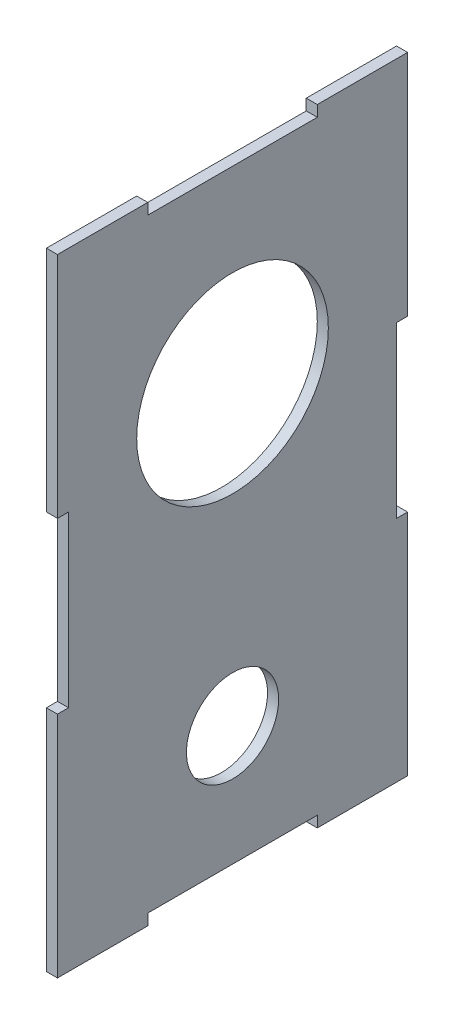
ISO-10303-21;
HEADER;
FILE_DESCRIPTION(('STEP AP214'),'2;1');
FILE_NAME('part.step','',(''),(''),'','','');
FILE_SCHEMA(('AUTOMOTIVE_DESIGN { 1 0 10303 214 1 1 1 1 }'));
ENDSEC;
DATA;
#1=APPLICATION_CONTEXT('core data for automotive mechanical design processes');
#2=APPLICATION_PROTOCOL_DEFINITION('international standard','automotive_design',2000,#1);
#3=PRODUCT_CONTEXT('',#1,'mechanical');
#4=PRODUCT('Part','Part','',(#3));
#5=PRODUCT_RELATED_PRODUCT_CATEGORY('part','',(#4));
#6=PRODUCT_DEFINITION_FORMATION('','',#4);
#7=PRODUCT_DEFINITION_CONTEXT('part definition',#1,'design');
#8=PRODUCT_DEFINITION('design','',#6,#7);
#9=PRODUCT_DEFINITION_SHAPE('','',#8);
#10=(LENGTH_UNIT() NAMED_UNIT(*) SI_UNIT(.MILLI.,.METRE.));
#11=(NAMED_UNIT(*) PLANE_ANGLE_UNIT() SI_UNIT($,.RADIAN.));
#12=(NAMED_UNIT(*) SI_UNIT($,.STERADIAN.) SOLID_ANGLE_UNIT());
#13=UNCERTAINTY_MEASURE_WITH_UNIT(LENGTH_MEASURE(1.E-05),#10,'distance_accuracy_value','');
#14=(GEOMETRIC_REPRESENTATION_CONTEXT(3) GLOBAL_UNCERTAINTY_ASSIGNED_CONTEXT((#13)) GLOBAL_UNIT_ASSIGNED_CONTEXT((#10,
#11,#12)) REPRESENTATION_CONTEXT('',''));
#15=CARTESIAN_POINT('',(0.,0.,0.));
#16=DIRECTION('',(0.,0.,1.));
#17=DIRECTION('',(1.,0.,0.));
#18=AXIS2_PLACEMENT_3D('',#15,#16,#17);
#19=CARTESIAN_POINT('',(3.,0.,0.));
#20=DIRECTION('',(-1.,0.,0.));
#21=DIRECTION('',(0.,0.,1.));
#22=AXIS2_PLACEMENT_3D('',#19,#20,#21);
#23=PLANE('',#22);
#24=DIRECTION('',(0.,-1.,0.));
#25=VECTOR('',#24,1.);
#26=CARTESIAN_POINT('',(3.,85.,47.5));
#27=LINE('',#26,#25);
#28=CARTESIAN_POINT('',(3.,85.,47.5));
#29=VERTEX_POINT('',#28);
#30=CARTESIAN_POINT('',(3.,23.,47.5));
#31=VERTEX_POINT('',#30);
#32=EDGE_CURVE('E241',#29,#31,#27,.T.);
#33=ORIENTED_EDGE('',*,*,#32,.T.);
#34=DIRECTION('',(0.,0.,-1.));
#35=VECTOR('',#34,1.);
#36=CARTESIAN_POINT('',(3.,23.,44.5));
#37=LINE('',#36,#35);
#38=CARTESIAN_POINT('',(3.,23.,44.5));
#39=VERTEX_POINT('',#38);
#40=EDGE_CURVE('E129',#31,#39,#37,.T.);
#41=ORIENTED_EDGE('',*,*,#40,.T.);
#42=DIRECTION('',(0.,-1.,0.));
#43=VECTOR('',#42,1.);
#44=CARTESIAN_POINT('',(3.,-23.,44.5));
#45=LINE('',#44,#43);
#46=CARTESIAN_POINT('',(3.,-23.,44.5));
#47=VERTEX_POINT('',#46);
#48=EDGE_CURVE('E292',#39,#47,#45,.T.);
#49=ORIENTED_EDGE('',*,*,#48,.T.);
#50=DIRECTION('',(0.,0.,1.));
#51=VECTOR('',#50,1.);
#52=CARTESIAN_POINT('',(3.,-23.,44.5));
#53=LINE('',#52,#51);
#54=CARTESIAN_POINT('',(3.,-23.,47.5));
#55=VERTEX_POINT('',#54);
#56=EDGE_CURVE('E311',#47,#55,#53,.T.);
#57=ORIENTED_EDGE('',*,*,#56,.T.);
#58=DIRECTION('',(0.,-1.,0.));
#59=VECTOR('',#58,1.);
#60=CARTESIAN_POINT('',(3.,-23.,47.5));
#61=LINE('',#60,#59);
#62=CARTESIAN_POINT('',(3.,-85.,47.5));
#63=VERTEX_POINT('',#62);
#64=EDGE_CURVE('E308',#55,#63,#61,.T.);
#65=ORIENTED_EDGE('',*,*,#64,.T.);
#66=DIRECTION('',(0.,0.,-1.));
#67=VECTOR('',#66,1.);
#68=CARTESIAN_POINT('',(3.,-85.,47.5));
#69=LINE('',#68,#67);
#70=CARTESIAN_POINT('',(3.,-85.,23.));
#71=VERTEX_POINT('',#70);
#72=EDGE_CURVE('E310',#63,#71,#69,.T.);
#73=ORIENTED_EDGE('',*,*,#72,.T.);
#74=DIRECTION('',(0.,1.,0.));
#75=VECTOR('',#74,1.);
#76=CARTESIAN_POINT('',(3.,-82.,23.));
#77=LINE('',#76,#75);
#78=CARTESIAN_POINT('',(3.,-82.,23.));
#79=VERTEX_POINT('',#78);
#80=EDGE_CURVE('E313',#71,#79,#77,.T.);
#81=ORIENTED_EDGE('',*,*,#80,.T.);
#82=DIRECTION('',(0.,0.,-1.));
#83=VECTOR('',#82,1.);
#84=CARTESIAN_POINT('',(3.,-82.,23.));
#85=LINE('',#84,#83);
#86=CARTESIAN_POINT('',(3.,-82.,-23.));
#87=VERTEX_POINT('',#86);
#88=EDGE_CURVE('E319',#79,#87,#85,.T.);
#89=ORIENTED_EDGE('',*,*,#88,.T.);
#90=DIRECTION('',(0.,-1.,0.));
#91=VECTOR('',#90,1.);
#92=CARTESIAN_POINT('',(3.,-82.,-23.));
#93=LINE('',#92,#91);
#94=CARTESIAN_POINT('',(3.,-85.,-23.));
#95=VERTEX_POINT('',#94);
#96=EDGE_CURVE('E321',#87,#95,#93,.T.);
#97=ORIENTED_EDGE('',*,*,#96,.T.);
#98=DIRECTION('',(0.,0.,-1.));
#99=VECTOR('',#98,1.);
#100=CARTESIAN_POINT('',(3.,-85.,-23.));
#101=LINE('',#100,#99);
#102=CARTESIAN_POINT('',(3.,-85.,-47.5));
#103=VERTEX_POINT('',#102);
#104=EDGE_CURVE('E323',#95,#103,#101,.T.);
#105=ORIENTED_EDGE('',*,*,#104,.T.);
#106=DIRECTION('',(0.,1.,0.));
#107=VECTOR('',#106,1.);
#108=CARTESIAN_POINT('',(3.,-23.,-47.5));
#109=LINE('',#108,#107);
#110=CARTESIAN_POINT('',(3.,-23.,-47.5));
#111=VERTEX_POINT('',#110);
#112=EDGE_CURVE('E325',#103,#111,#109,.T.);
#113=ORIENTED_EDGE('',*,*,#112,.T.);
#114=DIRECTION('',(0.,0.,1.));
#115=VECTOR('',#114,1.);
#116=CARTESIAN_POINT('',(3.,-23.,-44.5));
#117=LINE('',#116,#115);
#118=CARTESIAN_POINT('',(3.,-23.,-44.5));
#119=VERTEX_POINT('',#118);
#120=EDGE_CURVE('E327',#111,#119,#117,.T.);
#121=ORIENTED_EDGE('',*,*,#120,.T.);
#122=DIRECTION('',(0.,1.,0.));
#123=VECTOR('',#122,1.);
#124=CARTESIAN_POINT('',(3.,-23.,-44.5));
#125=LINE('',#124,#123);
#126=CARTESIAN_POINT('',(3.,23.,-44.5));
#127=VERTEX_POINT('',#126);
#128=EDGE_CURVE('E329',#119,#127,#125,.T.);
#129=ORIENTED_EDGE('',*,*,#128,.T.);
#130=DIRECTION('',(0.,0.,-1.));
#131=VECTOR('',#130,1.);
#132=CARTESIAN_POINT('',(3.,23.,-44.5));
#133=LINE('',#132,#131);
#134=CARTESIAN_POINT('',(3.,23.,-47.5));
#135=VERTEX_POINT('',#134);
#136=EDGE_CURVE('E331',#127,#135,#133,.T.);
#137=ORIENTED_EDGE('',*,*,#136,.T.);
#138=DIRECTION('',(0.,1.,0.));
#139=VECTOR('',#138,1.);
#140=CARTESIAN_POINT('',(3.,85.,-47.5));
#141=LINE('',#140,#139);
#142=CARTESIAN_POINT('',(3.,85.,-47.5));
#143=VERTEX_POINT('',#142);
#144=EDGE_CURVE('E333',#135,#143,#141,.T.);
#145=ORIENTED_EDGE('',*,*,#144,.T.);
#146=DIRECTION('',(0.,0.,1.));
#147=VECTOR('',#146,1.);
#148=CARTESIAN_POINT('',(3.,85.,-23.));
#149=LINE('',#148,#147);
#150=CARTESIAN_POINT('',(3.,85.,-23.));
#151=VERTEX_POINT('',#150);
#152=EDGE_CURVE('E335',#143,#151,#149,.T.);
#153=ORIENTED_EDGE('',*,*,#152,.T.);
#154=DIRECTION('',(0.,-1.,0.));
#155=VECTOR('',#154,1.);
#156=CARTESIAN_POINT('',(3.,82.,-23.));
#157=LINE('',#156,#155);
#158=CARTESIAN_POINT('',(3.,82.,-23.));
#159=VERTEX_POINT('',#158);
#160=EDGE_CURVE('E184',#151,#159,#157,.T.);
#161=ORIENTED_EDGE('',*,*,#160,.T.);
#162=DIRECTION('',(0.,0.,1.));
#163=VECTOR('',#162,1.);
#164=CARTESIAN_POINT('',(3.,82.,23.));
#165=LINE('',#164,#163);
#166=CARTESIAN_POINT('',(3.,82.,23.));
#167=VERTEX_POINT('',#166);
#168=EDGE_CURVE('E178',#159,#167,#165,.T.);
#169=ORIENTED_EDGE('',*,*,#168,.T.);
#170=DIRECTION('',(0.,1.,0.));
#171=VECTOR('',#170,1.);
#172=CARTESIAN_POINT('',(3.,82.,23.));
#173=LINE('',#172,#171);
#174=CARTESIAN_POINT('',(3.,85.,23.));
#175=VERTEX_POINT('',#174);
#176=EDGE_CURVE('E182',#167,#175,#173,.T.);
#177=ORIENTED_EDGE('',*,*,#176,.T.);
#178=DIRECTION('',(0.,0.,1.));
#179=VECTOR('',#178,1.);
#180=CARTESIAN_POINT('',(3.,85.,47.5));
#181=LINE('',#180,#179);
#182=EDGE_CURVE('E50',#175,#29,#181,.T.);
#183=ORIENTED_EDGE('',*,*,#182,.T.);
#184=EDGE_LOOP('',(#33,#41,#49,#57,#65,#73,#81,#89,#97,#105,#113,#121,#129,#137,#145,#153,#161,
#169,#177,#183));
#185=FACE_BOUND('',#184,.T.);
#186=CARTESIAN_POINT('',(3.,31.,0.));
#187=DIRECTION('',(1.,0.,0.));
#188=DIRECTION('',(0.,0.,-1.));
#189=AXIS2_PLACEMENT_3D('',#186,#187,#188);
#190=CIRCLE('',#189,26.);
#191=CARTESIAN_POINT('',(3.,31.,-26.));
#192=VERTEX_POINT('',#191);
#193=EDGE_CURVE('E206',#192,#192,#190,.T.);
#194=ORIENTED_EDGE('',*,*,#193,.F.);
#195=EDGE_LOOP('',(#194));
#196=FACE_BOUND('',#195,.T.);
#197=CARTESIAN_POINT('',(3.,-49.5,0.));
#198=DIRECTION('',(1.,0.,0.));
#199=DIRECTION('',(0.,0.,-1.));
#200=AXIS2_PLACEMENT_3D('',#197,#198,#199);
#201=CIRCLE('',#200,12.5);
#202=CARTESIAN_POINT('',(3.,-49.5,-12.5));
#203=VERTEX_POINT('',#202);
#204=EDGE_CURVE('E376',#203,#203,#201,.T.);
#205=ORIENTED_EDGE('',*,*,#204,.F.);
#206=EDGE_LOOP('',(#205));
#207=FACE_BOUND('',#206,.T.);
#208=ADVANCED_FACE('F33',(#185,#196,#207),#23,.F.);
#209=CARTESIAN_POINT('',(0.,0.,0.));
#210=DIRECTION('',(-1.,0.,0.));
#211=DIRECTION('',(0.,0.,1.));
#212=AXIS2_PLACEMENT_3D('',#209,#210,#211);
#213=PLANE('',#212);
#214=CARTESIAN_POINT('',(0.,31.,0.));
#215=DIRECTION('',(1.,0.,0.));
#216=DIRECTION('',(0.,0.,-1.));
#217=AXIS2_PLACEMENT_3D('',#214,#215,#216);
#218=CIRCLE('',#217,26.);
#219=CARTESIAN_POINT('',(0.,31.,-26.));
#220=VERTEX_POINT('',#219);
#221=EDGE_CURVE('E381',#220,#220,#218,.T.);
#222=ORIENTED_EDGE('',*,*,#221,.T.);
#223=EDGE_LOOP('',(#222));
#224=FACE_BOUND('',#223,.T.);
#225=DIRECTION('',(0.,-1.,0.));
#226=VECTOR('',#225,1.);
#227=CARTESIAN_POINT('',(0.,85.,47.5));
#228=LINE('',#227,#226);
#229=CARTESIAN_POINT('',(0.,85.,47.5));
#230=VERTEX_POINT('',#229);
#231=CARTESIAN_POINT('',(0.,23.,47.5));
#232=VERTEX_POINT('',#231);
#233=EDGE_CURVE('E202',#230,#232,#228,.T.);
#234=ORIENTED_EDGE('',*,*,#233,.F.);
#235=DIRECTION('',(0.,0.,1.));
#236=VECTOR('',#235,1.);
#237=CARTESIAN_POINT('',(0.,85.,47.5));
#238=LINE('',#237,#236);
#239=CARTESIAN_POINT('',(0.,85.,23.));
#240=VERTEX_POINT('',#239);
#241=EDGE_CURVE('E121',#240,#230,#238,.T.);
#242=ORIENTED_EDGE('',*,*,#241,.F.);
#243=DIRECTION('',(0.,1.,0.));
#244=VECTOR('',#243,1.);
#245=CARTESIAN_POINT('',(0.,82.,23.));
#246=LINE('',#245,#244);
#247=CARTESIAN_POINT('',(0.,82.,23.));
#248=VERTEX_POINT('',#247);
#249=EDGE_CURVE('E115',#248,#240,#246,.T.);
#250=ORIENTED_EDGE('',*,*,#249,.F.);
#251=DIRECTION('',(0.,0.,1.));
#252=VECTOR('',#251,1.);
#253=CARTESIAN_POINT('',(0.,82.,23.));
#254=LINE('',#253,#252);
#255=CARTESIAN_POINT('',(0.,82.,-23.));
#256=VERTEX_POINT('',#255);
#257=EDGE_CURVE('E192',#256,#248,#254,.T.);
#258=ORIENTED_EDGE('',*,*,#257,.F.);
#259=DIRECTION('',(0.,-1.,0.));
#260=VECTOR('',#259,1.);
#261=CARTESIAN_POINT('',(0.,82.,-23.));
#262=LINE('',#261,#260);
#263=CARTESIAN_POINT('',(0.,85.,-23.));
#264=VERTEX_POINT('',#263);
#265=EDGE_CURVE('E236',#264,#256,#262,.T.);
#266=ORIENTED_EDGE('',*,*,#265,.F.);
#267=DIRECTION('',(0.,0.,1.));
#268=VECTOR('',#267,1.);
#269=CARTESIAN_POINT('',(0.,85.,-23.));
#270=LINE('',#269,#268);
#271=CARTESIAN_POINT('',(0.,85.,-47.5));
#272=VERTEX_POINT('',#271);
#273=EDGE_CURVE('E234',#272,#264,#270,.T.);
#274=ORIENTED_EDGE('',*,*,#273,.F.);
#275=DIRECTION('',(0.,1.,0.));
#276=VECTOR('',#275,1.);
#277=CARTESIAN_POINT('',(0.,85.,-47.5));
#278=LINE('',#277,#276);
#279=CARTESIAN_POINT('',(0.,23.,-47.5));
#280=VERTEX_POINT('',#279);
#281=EDGE_CURVE('E232',#280,#272,#278,.T.);
#282=ORIENTED_EDGE('',*,*,#281,.F.);
#283=DIRECTION('',(0.,0.,-1.));
#284=VECTOR('',#283,1.);
#285=CARTESIAN_POINT('',(0.,23.,-44.5));
#286=LINE('',#285,#284);
#287=CARTESIAN_POINT('',(0.,23.,-44.5));
#288=VERTEX_POINT('',#287);
#289=EDGE_CURVE('E230',#288,#280,#286,.T.);
#290=ORIENTED_EDGE('',*,*,#289,.F.);
#291=DIRECTION('',(0.,1.,0.));
#292=VECTOR('',#291,1.);
#293=CARTESIAN_POINT('',(0.,-23.,-44.5));
#294=LINE('',#293,#292);
#295=CARTESIAN_POINT('',(0.,-23.,-44.5));
#296=VERTEX_POINT('',#295);
#297=EDGE_CURVE('E228',#296,#288,#294,.T.);
#298=ORIENTED_EDGE('',*,*,#297,.F.);
#299=DIRECTION('',(0.,0.,1.));
#300=VECTOR('',#299,1.);
#301=CARTESIAN_POINT('',(0.,-23.,-44.5));
#302=LINE('',#301,#300);
#303=CARTESIAN_POINT('',(0.,-23.,-47.5));
#304=VERTEX_POINT('',#303);
#305=EDGE_CURVE('E226',#304,#296,#302,.T.);
#306=ORIENTED_EDGE('',*,*,#305,.F.);
#307=DIRECTION('',(0.,1.,0.));
#308=VECTOR('',#307,1.);
#309=CARTESIAN_POINT('',(0.,-23.,-47.5));
#310=LINE('',#309,#308);
#311=CARTESIAN_POINT('',(0.,-85.,-47.5));
#312=VERTEX_POINT('',#311);
#313=EDGE_CURVE('E224',#312,#304,#310,.T.);
#314=ORIENTED_EDGE('',*,*,#313,.F.);
#315=DIRECTION('',(0.,0.,-1.));
#316=VECTOR('',#315,1.);
#317=CARTESIAN_POINT('',(0.,-85.,-23.));
#318=LINE('',#317,#316);
#319=CARTESIAN_POINT('',(0.,-85.,-23.));
#320=VERTEX_POINT('',#319);
#321=EDGE_CURVE('E222',#320,#312,#318,.T.);
#322=ORIENTED_EDGE('',*,*,#321,.F.);
#323=DIRECTION('',(0.,-1.,0.));
#324=VECTOR('',#323,1.);
#325=CARTESIAN_POINT('',(0.,-82.,-23.));
#326=LINE('',#325,#324);
#327=CARTESIAN_POINT('',(0.,-82.,-23.));
#328=VERTEX_POINT('',#327);
#329=EDGE_CURVE('E220',#328,#320,#326,.T.);
#330=ORIENTED_EDGE('',*,*,#329,.F.);
#331=DIRECTION('',(0.,0.,-1.));
#332=VECTOR('',#331,1.);
#333=CARTESIAN_POINT('',(0.,-82.,23.));
#334=LINE('',#333,#332);
#335=CARTESIAN_POINT('',(0.,-82.,23.));
#336=VERTEX_POINT('',#335);
#337=EDGE_CURVE('E218',#336,#328,#334,.T.);
#338=ORIENTED_EDGE('',*,*,#337,.F.);
#339=DIRECTION('',(0.,1.,0.));
#340=VECTOR('',#339,1.);
#341=CARTESIAN_POINT('',(0.,-82.,23.));
#342=LINE('',#341,#340);
#343=CARTESIAN_POINT('',(0.,-85.,23.));
#344=VERTEX_POINT('',#343);
#345=EDGE_CURVE('E216',#344,#336,#342,.T.);
#346=ORIENTED_EDGE('',*,*,#345,.F.);
#347=DIRECTION('',(0.,0.,-1.));
#348=VECTOR('',#347,1.);
#349=CARTESIAN_POINT('',(0.,-85.,47.5));
#350=LINE('',#349,#348);
#351=CARTESIAN_POINT('',(0.,-85.,47.5));
#352=VERTEX_POINT('',#351);
#353=EDGE_CURVE('E214',#352,#344,#350,.T.);
#354=ORIENTED_EDGE('',*,*,#353,.F.);
#355=DIRECTION('',(0.,-1.,0.));
#356=VECTOR('',#355,1.);
#357=CARTESIAN_POINT('',(0.,-23.,47.5));
#358=LINE('',#357,#356);
#359=CARTESIAN_POINT('',(0.,-23.,47.5));
#360=VERTEX_POINT('',#359);
#361=EDGE_CURVE('E212',#360,#352,#358,.T.);
#362=ORIENTED_EDGE('',*,*,#361,.F.);
#363=DIRECTION('',(0.,0.,1.));
#364=VECTOR('',#363,1.);
#365=CARTESIAN_POINT('',(0.,-23.,44.5));
#366=LINE('',#365,#364);
#367=CARTESIAN_POINT('',(0.,-23.,44.5));
#368=VERTEX_POINT('',#367);
#369=EDGE_CURVE('E210',#368,#360,#366,.T.);
#370=ORIENTED_EDGE('',*,*,#369,.F.);
#371=DIRECTION('',(0.,-1.,0.));
#372=VECTOR('',#371,1.);
#373=CARTESIAN_POINT('',(0.,-23.,44.5));
#374=LINE('',#373,#372);
#375=CARTESIAN_POINT('',(0.,23.,44.5));
#376=VERTEX_POINT('',#375);
#377=EDGE_CURVE('E208',#376,#368,#374,.T.);
#378=ORIENTED_EDGE('',*,*,#377,.F.);
#379=DIRECTION('',(0.,0.,-1.));
#380=VECTOR('',#379,1.);
#381=CARTESIAN_POINT('',(0.,23.,44.5));
#382=LINE('',#381,#380);
#383=EDGE_CURVE('E205',#232,#376,#382,.T.);
#384=ORIENTED_EDGE('',*,*,#383,.F.);
#385=EDGE_LOOP('',(#234,#242,#250,#258,#266,#274,#282,#290,#298,#306,#314,#322,#330,#338,#346,
#354,#362,#370,#378,#384));
#386=FACE_BOUND('',#385,.T.);
#387=CARTESIAN_POINT('',(0.,-49.5,0.));
#388=DIRECTION('',(1.,0.,0.));
#389=DIRECTION('',(0.,0.,-1.));
#390=AXIS2_PLACEMENT_3D('',#387,#388,#389);
#391=CIRCLE('',#390,12.5);
#392=CARTESIAN_POINT('',(0.,-49.5,-12.5));
#393=VERTEX_POINT('',#392);
#394=EDGE_CURVE('E379',#393,#393,#391,.T.);
#395=ORIENTED_EDGE('',*,*,#394,.T.);
#396=EDGE_LOOP('',(#395));
#397=FACE_BOUND('',#396,.T.);
#398=ADVANCED_FACE('F296',(#224,#386,#397),#213,.T.);
#399=CARTESIAN_POINT('',(3.,85.,47.5));
#400=DIRECTION('',(0.,0.,-1.));
#401=DIRECTION('',(0.,1.,0.));
#402=AXIS2_PLACEMENT_3D('',#399,#400,#401);
#403=PLANE('',#402);
#404=ORIENTED_EDGE('',*,*,#233,.T.);
#405=DIRECTION('',(-1.,0.,0.));
#406=VECTOR('',#405,1.);
#407=CARTESIAN_POINT('',(3.,23.,47.5));
#408=LINE('',#407,#406);
#409=EDGE_CURVE('E11',#31,#232,#408,.T.);
#410=ORIENTED_EDGE('',*,*,#409,.F.);
#411=ORIENTED_EDGE('',*,*,#32,.F.);
#412=DIRECTION('',(-1.,0.,0.));
#413=VECTOR('',#412,1.);
#414=CARTESIAN_POINT('',(3.,85.,47.5));
#415=LINE('',#414,#413);
#416=EDGE_CURVE('E198',#29,#230,#415,.T.);
#417=ORIENTED_EDGE('',*,*,#416,.T.);
#418=EDGE_LOOP('',(#404,#410,#411,#417));
#419=FACE_BOUND('',#418,.T.);
#420=ADVANCED_FACE('F35',(#419),#403,.F.);
#421=CARTESIAN_POINT('',(3.,23.,44.5));
#422=DIRECTION('',(0.,1.,0.));
#423=DIRECTION('',(0.,0.,1.));
#424=AXIS2_PLACEMENT_3D('',#421,#422,#423);
#425=PLANE('',#424);
#426=ORIENTED_EDGE('',*,*,#383,.T.);
#427=DIRECTION('',(-1.,0.,0.));
#428=VECTOR('',#427,1.);
#429=CARTESIAN_POINT('',(3.,23.,44.5));
#430=LINE('',#429,#428);
#431=EDGE_CURVE('E42',#39,#376,#430,.T.);
#432=ORIENTED_EDGE('',*,*,#431,.F.);
#433=ORIENTED_EDGE('',*,*,#40,.F.);
#434=ORIENTED_EDGE('',*,*,#409,.T.);
#435=EDGE_LOOP('',(#426,#432,#433,#434));
#436=FACE_BOUND('',#435,.T.);
#437=ADVANCED_FACE('F556',(#436),#425,.F.);
#438=CARTESIAN_POINT('',(3.,-23.,44.5));
#439=DIRECTION('',(0.,0.,-1.));
#440=DIRECTION('',(0.,1.,0.));
#441=AXIS2_PLACEMENT_3D('',#438,#439,#440);
#442=PLANE('',#441);
#443=ORIENTED_EDGE('',*,*,#377,.T.);
#444=DIRECTION('',(-1.,0.,0.));
#445=VECTOR('',#444,1.);
#446=CARTESIAN_POINT('',(3.,-23.,44.5));
#447=LINE('',#446,#445);
#448=EDGE_CURVE('E284',#47,#368,#447,.T.);
#449=ORIENTED_EDGE('',*,*,#448,.F.);
#450=ORIENTED_EDGE('',*,*,#48,.F.);
#451=ORIENTED_EDGE('',*,*,#431,.T.);
#452=EDGE_LOOP('',(#443,#449,#450,#451));
#453=FACE_BOUND('',#452,.T.);
#454=ADVANCED_FACE('F290',(#453),#442,.F.);
#455=CARTESIAN_POINT('',(3.,-23.,44.5));
#456=DIRECTION('',(0.,-1.,0.));
#457=DIRECTION('',(0.,0.,-1.));
#458=AXIS2_PLACEMENT_3D('',#455,#456,#457);
#459=PLANE('',#458);
#460=ORIENTED_EDGE('',*,*,#369,.T.);
#461=DIRECTION('',(-1.,0.,0.));
#462=VECTOR('',#461,1.);
#463=CARTESIAN_POINT('',(3.,-23.,47.5));
#464=LINE('',#463,#462);
#465=EDGE_CURVE('E281',#55,#360,#464,.T.);
#466=ORIENTED_EDGE('',*,*,#465,.F.);
#467=ORIENTED_EDGE('',*,*,#56,.F.);
#468=ORIENTED_EDGE('',*,*,#448,.T.);
#469=EDGE_LOOP('',(#460,#466,#467,#468));
#470=FACE_BOUND('',#469,.T.);
#471=ADVANCED_FACE('F302',(#470),#459,.F.);
#472=CARTESIAN_POINT('',(3.,-23.,47.5));
#473=DIRECTION('',(0.,0.,-1.));
#474=DIRECTION('',(0.,1.,0.));
#475=AXIS2_PLACEMENT_3D('',#472,#473,#474);
#476=PLANE('',#475);
#477=ORIENTED_EDGE('',*,*,#361,.T.);
#478=DIRECTION('',(-1.,0.,0.));
#479=VECTOR('',#478,1.);
#480=CARTESIAN_POINT('',(3.,-85.,47.5));
#481=LINE('',#480,#479);
#482=EDGE_CURVE('E278',#63,#352,#481,.T.);
#483=ORIENTED_EDGE('',*,*,#482,.F.);
#484=ORIENTED_EDGE('',*,*,#64,.F.);
#485=ORIENTED_EDGE('',*,*,#465,.T.);
#486=EDGE_LOOP('',(#477,#483,#484,#485));
#487=FACE_BOUND('',#486,.T.);
#488=ADVANCED_FACE('F306',(#487),#476,.F.);
#489=CARTESIAN_POINT('',(3.,-85.,47.5));
#490=DIRECTION('',(0.,1.,0.));
#491=DIRECTION('',(0.,0.,1.));
#492=AXIS2_PLACEMENT_3D('',#489,#490,#491);
#493=PLANE('',#492);
#494=ORIENTED_EDGE('',*,*,#353,.T.);
#495=DIRECTION('',(-1.,0.,0.));
#496=VECTOR('',#495,1.);
#497=CARTESIAN_POINT('',(3.,-85.,23.));
#498=LINE('',#497,#496);
#499=EDGE_CURVE('E275',#71,#344,#498,.T.);
#500=ORIENTED_EDGE('',*,*,#499,.F.);
#501=ORIENTED_EDGE('',*,*,#72,.F.);
#502=ORIENTED_EDGE('',*,*,#482,.T.);
#503=EDGE_LOOP('',(#494,#500,#501,#502));
#504=FACE_BOUND('',#503,.T.);
#505=ADVANCED_FACE('F521',(#504),#493,.F.);
#506=CARTESIAN_POINT('',(3.,-82.,23.));
#507=DIRECTION('',(0.,0.,1.));
#508=DIRECTION('',(1.,0.,0.));
#509=AXIS2_PLACEMENT_3D('',#506,#507,#508);
#510=PLANE('',#509);
#511=ORIENTED_EDGE('',*,*,#345,.T.);
#512=DIRECTION('',(-1.,0.,0.));
#513=VECTOR('',#512,1.);
#514=CARTESIAN_POINT('',(3.,-82.,23.));
#515=LINE('',#514,#513);
#516=EDGE_CURVE('E272',#79,#336,#515,.T.);
#517=ORIENTED_EDGE('',*,*,#516,.F.);
#518=ORIENTED_EDGE('',*,*,#80,.F.);
#519=ORIENTED_EDGE('',*,*,#499,.T.);
#520=EDGE_LOOP('',(#511,#517,#518,#519));
#521=FACE_BOUND('',#520,.T.);
#522=ADVANCED_FACE('F511',(#521),#510,.F.);
#523=CARTESIAN_POINT('',(3.,-82.,23.));
#524=DIRECTION('',(0.,1.,0.));
#525=DIRECTION('',(0.,0.,1.));
#526=AXIS2_PLACEMENT_3D('',#523,#524,#525);
#527=PLANE('',#526);
#528=ORIENTED_EDGE('',*,*,#337,.T.);
#529=DIRECTION('',(-1.,0.,0.));
#530=VECTOR('',#529,1.);
#531=CARTESIAN_POINT('',(3.,-82.,-23.));
#532=LINE('',#531,#530);
#533=EDGE_CURVE('E269',#87,#328,#532,.T.);
#534=ORIENTED_EDGE('',*,*,#533,.F.);
#535=ORIENTED_EDGE('',*,*,#88,.F.);
#536=ORIENTED_EDGE('',*,*,#516,.T.);
#537=EDGE_LOOP('',(#528,#534,#535,#536));
#538=FACE_BOUND('',#537,.T.);
#539=ADVANCED_FACE('F501',(#538),#527,.F.);
#540=CARTESIAN_POINT('',(3.,-82.,-23.));
#541=DIRECTION('',(0.,0.,-1.));
#542=DIRECTION('',(-1.,0.,0.));
#543=AXIS2_PLACEMENT_3D('',#540,#541,#542);
#544=PLANE('',#543);
#545=ORIENTED_EDGE('',*,*,#329,.T.);
#546=DIRECTION('',(-1.,0.,0.));
#547=VECTOR('',#546,1.);
#548=CARTESIAN_POINT('',(3.,-85.,-23.));
#549=LINE('',#548,#547);
#550=EDGE_CURVE('E266',#95,#320,#549,.T.);
#551=ORIENTED_EDGE('',*,*,#550,.F.);
#552=ORIENTED_EDGE('',*,*,#96,.F.);
#553=ORIENTED_EDGE('',*,*,#533,.T.);
#554=EDGE_LOOP('',(#545,#551,#552,#553));
#555=FACE_BOUND('',#554,.T.);
#556=ADVANCED_FACE('F491',(#555),#544,.F.);
#557=CARTESIAN_POINT('',(3.,-85.,-23.));
#558=DIRECTION('',(0.,1.,0.));
#559=DIRECTION('',(0.,0.,1.));
#560=AXIS2_PLACEMENT_3D('',#557,#558,#559);
#561=PLANE('',#560);
#562=ORIENTED_EDGE('',*,*,#321,.T.);
#563=DIRECTION('',(-1.,0.,0.));
#564=VECTOR('',#563,1.);
#565=CARTESIAN_POINT('',(3.,-85.,-47.5));
#566=LINE('',#565,#564);
#567=EDGE_CURVE('E263',#103,#312,#566,.T.);
#568=ORIENTED_EDGE('',*,*,#567,.F.);
#569=ORIENTED_EDGE('',*,*,#104,.F.);
#570=ORIENTED_EDGE('',*,*,#550,.T.);
#571=EDGE_LOOP('',(#562,#568,#569,#570));
#572=FACE_BOUND('',#571,.T.);
#573=ADVANCED_FACE('F481',(#572),#561,.F.);
#574=CARTESIAN_POINT('',(3.,-23.,-47.5));
#575=DIRECTION('',(0.,0.,1.));
#576=DIRECTION('',(0.,-1.,0.));
#577=AXIS2_PLACEMENT_3D('',#574,#575,#576);
#578=PLANE('',#577);
#579=ORIENTED_EDGE('',*,*,#313,.T.);
#580=DIRECTION('',(-1.,0.,0.));
#581=VECTOR('',#580,1.);
#582=CARTESIAN_POINT('',(3.,-23.,-47.5));
#583=LINE('',#582,#581);
#584=EDGE_CURVE('E260',#111,#304,#583,.T.);
#585=ORIENTED_EDGE('',*,*,#584,.F.);
#586=ORIENTED_EDGE('',*,*,#112,.F.);
#587=ORIENTED_EDGE('',*,*,#567,.T.);
#588=EDGE_LOOP('',(#579,#585,#586,#587));
#589=FACE_BOUND('',#588,.T.);
#590=ADVANCED_FACE('F471',(#589),#578,.F.);
#591=CARTESIAN_POINT('',(3.,-23.,-44.5));
#592=DIRECTION('',(0.,-1.,0.));
#593=DIRECTION('',(0.,0.,-1.));
#594=AXIS2_PLACEMENT_3D('',#591,#592,#593);
#595=PLANE('',#594);
#596=ORIENTED_EDGE('',*,*,#305,.T.);
#597=DIRECTION('',(-1.,0.,0.));
#598=VECTOR('',#597,1.);
#599=CARTESIAN_POINT('',(3.,-23.,-44.5));
#600=LINE('',#599,#598);
#601=EDGE_CURVE('E257',#119,#296,#600,.T.);
#602=ORIENTED_EDGE('',*,*,#601,.F.);
#603=ORIENTED_EDGE('',*,*,#120,.F.);
#604=ORIENTED_EDGE('',*,*,#584,.T.);
#605=EDGE_LOOP('',(#596,#602,#603,#604));
#606=FACE_BOUND('',#605,.T.);
#607=ADVANCED_FACE('F461',(#606),#595,.F.);
#608=CARTESIAN_POINT('',(3.,-23.,-44.5));
#609=DIRECTION('',(0.,0.,1.));
#610=DIRECTION('',(1.,0.,0.));
#611=AXIS2_PLACEMENT_3D('',#608,#609,#610);
#612=PLANE('',#611);
#613=ORIENTED_EDGE('',*,*,#297,.T.);
#614=DIRECTION('',(-1.,0.,0.));
#615=VECTOR('',#614,1.);
#616=CARTESIAN_POINT('',(3.,23.,-44.5));
#617=LINE('',#616,#615);
#618=EDGE_CURVE('E254',#127,#288,#617,.T.);
#619=ORIENTED_EDGE('',*,*,#618,.F.);
#620=ORIENTED_EDGE('',*,*,#128,.F.);
#621=ORIENTED_EDGE('',*,*,#601,.T.);
#622=EDGE_LOOP('',(#613,#619,#620,#621));
#623=FACE_BOUND('',#622,.T.);
#624=ADVANCED_FACE('F451',(#623),#612,.F.);
#625=CARTESIAN_POINT('',(3.,23.,-44.5));
#626=DIRECTION('',(0.,1.,0.));
#627=DIRECTION('',(0.,0.,1.));
#628=AXIS2_PLACEMENT_3D('',#625,#626,#627);
#629=PLANE('',#628);
#630=ORIENTED_EDGE('',*,*,#289,.T.);
#631=DIRECTION('',(-1.,0.,0.));
#632=VECTOR('',#631,1.);
#633=CARTESIAN_POINT('',(3.,23.,-47.5));
#634=LINE('',#633,#632);
#635=EDGE_CURVE('E251',#135,#280,#634,.T.);
#636=ORIENTED_EDGE('',*,*,#635,.F.);
#637=ORIENTED_EDGE('',*,*,#136,.F.);
#638=ORIENTED_EDGE('',*,*,#618,.T.);
#639=EDGE_LOOP('',(#630,#636,#637,#638));
#640=FACE_BOUND('',#639,.T.);
#641=ADVANCED_FACE('F441',(#640),#629,.F.);
#642=CARTESIAN_POINT('',(3.,85.,-47.5));
#643=DIRECTION('',(0.,0.,1.));
#644=DIRECTION('',(0.,-1.,0.));
#645=AXIS2_PLACEMENT_3D('',#642,#643,#644);
#646=PLANE('',#645);
#647=ORIENTED_EDGE('',*,*,#281,.T.);
#648=DIRECTION('',(-1.,0.,0.));
#649=VECTOR('',#648,1.);
#650=CARTESIAN_POINT('',(3.,85.,-47.5));
#651=LINE('',#650,#649);
#652=EDGE_CURVE('E248',#143,#272,#651,.T.);
#653=ORIENTED_EDGE('',*,*,#652,.F.);
#654=ORIENTED_EDGE('',*,*,#144,.F.);
#655=ORIENTED_EDGE('',*,*,#635,.T.);
#656=EDGE_LOOP('',(#647,#653,#654,#655));
#657=FACE_BOUND('',#656,.T.);
#658=ADVANCED_FACE('F432',(#657),#646,.F.);
#659=CARTESIAN_POINT('',(3.,85.,-23.));
#660=DIRECTION('',(0.,-1.,0.));
#661=DIRECTION('',(0.,0.,-1.));
#662=AXIS2_PLACEMENT_3D('',#659,#660,#661);
#663=PLANE('',#662);
#664=ORIENTED_EDGE('',*,*,#273,.T.);
#665=DIRECTION('',(-1.,0.,0.));
#666=VECTOR('',#665,1.);
#667=CARTESIAN_POINT('',(3.,85.,-23.));
#668=LINE('',#667,#666);
#669=EDGE_CURVE('E245',#151,#264,#668,.T.);
#670=ORIENTED_EDGE('',*,*,#669,.F.);
#671=ORIENTED_EDGE('',*,*,#152,.F.);
#672=ORIENTED_EDGE('',*,*,#652,.T.);
#673=EDGE_LOOP('',(#664,#670,#671,#672));
#674=FACE_BOUND('',#673,.T.);
#675=ADVANCED_FACE('F341',(#674),#663,.F.);
#676=CARTESIAN_POINT('',(3.,82.,-23.));
#677=DIRECTION('',(0.,0.,-1.));
#678=DIRECTION('',(-1.,0.,0.));
#679=AXIS2_PLACEMENT_3D('',#676,#677,#678);
#680=PLANE('',#679);
#681=ORIENTED_EDGE('',*,*,#265,.T.);
#682=DIRECTION('',(-1.,0.,0.));
#683=VECTOR('',#682,1.);
#684=CARTESIAN_POINT('',(3.,82.,-23.));
#685=LINE('',#684,#683);
#686=EDGE_CURVE('E193',#159,#256,#685,.T.);
#687=ORIENTED_EDGE('',*,*,#686,.F.);
#688=ORIENTED_EDGE('',*,*,#160,.F.);
#689=ORIENTED_EDGE('',*,*,#669,.T.);
#690=EDGE_LOOP('',(#681,#687,#688,#689));
#691=FACE_BOUND('',#690,.T.);
#692=ADVANCED_FACE('F345',(#691),#680,.F.);
#693=CARTESIAN_POINT('',(3.,82.,23.));
#694=DIRECTION('',(0.,-1.,0.));
#695=DIRECTION('',(0.,0.,-1.));
#696=AXIS2_PLACEMENT_3D('',#693,#694,#695);
#697=PLANE('',#696);
#698=ORIENTED_EDGE('',*,*,#257,.T.);
#699=DIRECTION('',(-1.,0.,0.));
#700=VECTOR('',#699,1.);
#701=CARTESIAN_POINT('',(3.,82.,23.));
#702=LINE('',#701,#700);
#703=EDGE_CURVE('E189',#167,#248,#702,.T.);
#704=ORIENTED_EDGE('',*,*,#703,.F.);
#705=ORIENTED_EDGE('',*,*,#168,.F.);
#706=ORIENTED_EDGE('',*,*,#686,.T.);
#707=EDGE_LOOP('',(#698,#704,#705,#706));
#708=FACE_BOUND('',#707,.T.);
#709=ADVANCED_FACE('F190',(#708),#697,.F.);
#710=CARTESIAN_POINT('',(3.,82.,23.));
#711=DIRECTION('',(0.,0.,1.));
#712=DIRECTION('',(1.,0.,0.));
#713=AXIS2_PLACEMENT_3D('',#710,#711,#712);
#714=PLANE('',#713);
#715=ORIENTED_EDGE('',*,*,#249,.T.);
#716=DIRECTION('',(-1.,0.,0.));
#717=VECTOR('',#716,1.);
#718=CARTESIAN_POINT('',(3.,85.,23.));
#719=LINE('',#718,#717);
#720=EDGE_CURVE('E194',#175,#240,#719,.T.);
#721=ORIENTED_EDGE('',*,*,#720,.F.);
#722=ORIENTED_EDGE('',*,*,#176,.F.);
#723=ORIENTED_EDGE('',*,*,#703,.T.);
#724=EDGE_LOOP('',(#715,#721,#722,#723));
#725=FACE_BOUND('',#724,.T.);
#726=ADVANCED_FACE('F196',(#725),#714,.F.);
#727=CARTESIAN_POINT('',(3.,85.,47.5));
#728=DIRECTION('',(0.,-1.,0.));
#729=DIRECTION('',(0.,0.,-1.));
#730=AXIS2_PLACEMENT_3D('',#727,#728,#729);
#731=PLANE('',#730);
#732=ORIENTED_EDGE('',*,*,#241,.T.);
#733=ORIENTED_EDGE('',*,*,#416,.F.);
#734=ORIENTED_EDGE('',*,*,#182,.F.);
#735=ORIENTED_EDGE('',*,*,#720,.T.);
#736=EDGE_LOOP('',(#732,#733,#734,#735));
#737=FACE_BOUND('',#736,.T.);
#738=ADVANCED_FACE('F349',(#737),#731,.F.);
#739=CARTESIAN_POINT('',(3.,31.,0.));
#740=DIRECTION('',(-1.,0.,0.));
#741=DIRECTION('',(0.,0.,1.));
#742=AXIS2_PLACEMENT_3D('',#739,#740,#741);
#743=CYLINDRICAL_SURFACE('',#742,26.);
#744=ORIENTED_EDGE('',*,*,#193,.T.);
#745=EDGE_LOOP('',(#744));
#746=FACE_BOUND('',#745,.T.);
#747=ORIENTED_EDGE('',*,*,#221,.F.);
#748=EDGE_LOOP('',(#747));
#749=FACE_BOUND('',#748,.T.);
#750=ADVANCED_FACE('F351',(#746,#749),#743,.F.);
#751=CARTESIAN_POINT('',(3.,-49.5,0.));
#752=DIRECTION('',(-1.,0.,0.));
#753=DIRECTION('',(0.,0.,1.));
#754=AXIS2_PLACEMENT_3D('',#751,#752,#753);
#755=CYLINDRICAL_SURFACE('',#754,12.5);
#756=ORIENTED_EDGE('',*,*,#204,.T.);
#757=EDGE_LOOP('',(#756));
#758=FACE_BOUND('',#757,.T.);
#759=ORIENTED_EDGE('',*,*,#394,.F.);
#760=EDGE_LOOP('',(#759));
#761=FACE_BOUND('',#760,.T.);
#762=ADVANCED_FACE('F357',(#758,#761),#755,.F.);
#763=CLOSED_SHELL('',(#208,#398,#420,#437,#454,#471,#488,#505,#522,#539,#556,#573,#590,#607,
#624,#641,#658,#675,#692,#709,#726,#738,#750,#762));
#764=MANIFOLD_SOLID_BREP('B2',#763);
#765=ADVANCED_BREP_SHAPE_REPRESENTATION('',(#18,#764),#14);
#766=SHAPE_DEFINITION_REPRESENTATION(#9,#765);
ENDSEC;
END-ISO-10303-21;
